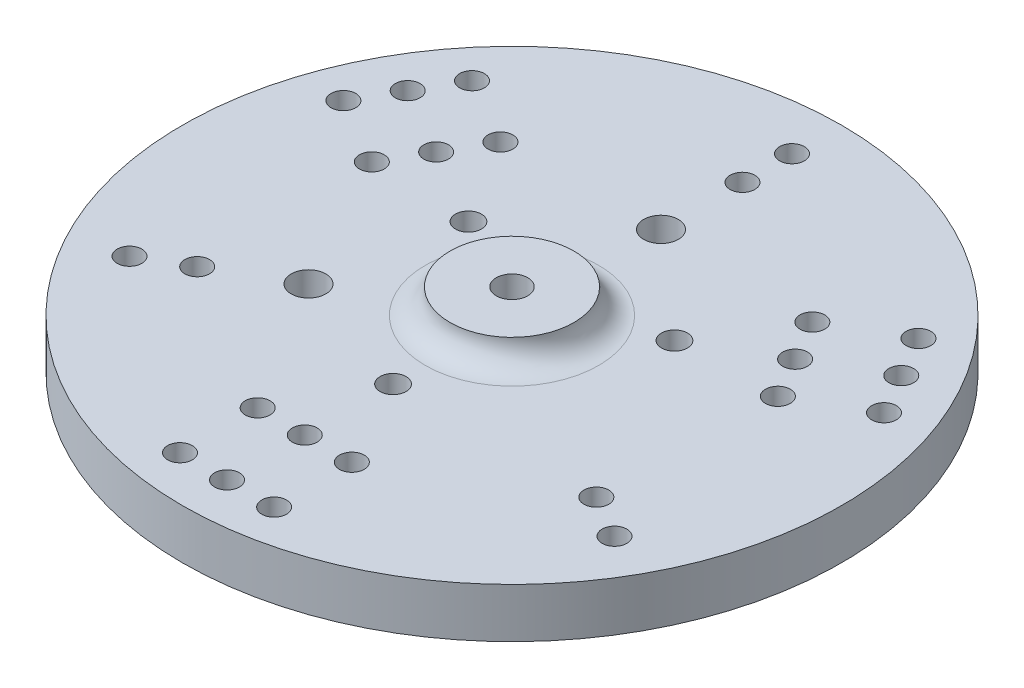
ISO-10303-21;
HEADER;
FILE_DESCRIPTION(('STEP AP214'),'2;1');
FILE_NAME('part.step','',(''),(''),'','','');
FILE_SCHEMA(('AUTOMOTIVE_DESIGN { 1 0 10303 214 1 1 1 1 }'));
ENDSEC;
DATA;
#1=APPLICATION_CONTEXT('core data for automotive mechanical design processes');
#2=APPLICATION_PROTOCOL_DEFINITION('international standard','automotive_design',2000,#1);
#3=PRODUCT_CONTEXT('',#1,'mechanical');
#4=PRODUCT('Part','Part','',(#3));
#5=PRODUCT_RELATED_PRODUCT_CATEGORY('part','',(#4));
#6=PRODUCT_DEFINITION_FORMATION('','',#4);
#7=PRODUCT_DEFINITION_CONTEXT('part definition',#1,'design');
#8=PRODUCT_DEFINITION('design','',#6,#7);
#9=PRODUCT_DEFINITION_SHAPE('','',#8);
#10=(LENGTH_UNIT() NAMED_UNIT(*) SI_UNIT(.MILLI.,.METRE.));
#11=(NAMED_UNIT(*) PLANE_ANGLE_UNIT() SI_UNIT($,.RADIAN.));
#12=(NAMED_UNIT(*) SI_UNIT($,.STERADIAN.) SOLID_ANGLE_UNIT());
#13=UNCERTAINTY_MEASURE_WITH_UNIT(LENGTH_MEASURE(1.E-05),#10,'distance_accuracy_value','');
#14=(GEOMETRIC_REPRESENTATION_CONTEXT(3) GLOBAL_UNCERTAINTY_ASSIGNED_CONTEXT((#13)) GLOBAL_UNIT_ASSIGNED_CONTEXT((#10,
#11,#12)) REPRESENTATION_CONTEXT('',''));
#15=CARTESIAN_POINT('',(0.,0.,0.));
#16=DIRECTION('',(0.,0.,1.));
#17=DIRECTION('',(1.,0.,0.));
#18=AXIS2_PLACEMENT_3D('',#15,#16,#17);
#19=CARTESIAN_POINT('',(0.,10.,0.));
#20=DIRECTION('',(0.,-1.,0.));
#21=DIRECTION('',(0.,0.,-1.));
#22=AXIS2_PLACEMENT_3D('',#19,#20,#21);
#23=CYLINDRICAL_SURFACE('',#22,4.125);
#24=CARTESIAN_POINT('',(0.,0.,0.));
#25=DIRECTION('',(0.,1.,0.));
#26=DIRECTION('',(0.,0.,1.));
#27=AXIS2_PLACEMENT_3D('',#24,#25,#26);
#28=CIRCLE('',#27,4.125);
#29=CARTESIAN_POINT('',(0.,0.,4.125));
#30=VERTEX_POINT('',#29);
#31=EDGE_CURVE('E330',#30,#30,#28,.T.);
#32=ORIENTED_EDGE('',*,*,#31,.F.);
#33=EDGE_LOOP('',(#32));
#34=FACE_BOUND('',#33,.T.);
#35=CARTESIAN_POINT('',(0.,9.5,0.));
#36=DIRECTION('',(0.,1.,0.));
#37=DIRECTION('',(0.,0.,1.));
#38=AXIS2_PLACEMENT_3D('',#35,#36,#37);
#39=CIRCLE('',#38,4.125);
#40=CARTESIAN_POINT('',(0.,9.5,4.125));
#41=VERTEX_POINT('',#40);
#42=EDGE_CURVE('E182',#41,#41,#39,.T.);
#43=ORIENTED_EDGE('',*,*,#42,.T.);
#44=EDGE_LOOP('',(#43));
#45=FACE_BOUND('',#44,.T.);
#46=ADVANCED_FACE('F163',(#34,#45),#23,.F.);
#47=CARTESIAN_POINT('',(0.,10.,0.));
#48=DIRECTION('',(0.,-1.,0.));
#49=DIRECTION('',(0.,0.,-1.));
#50=AXIS2_PLACEMENT_3D('',#47,#48,#49);
#51=CYLINDRICAL_SURFACE('',#50,66.5);
#52=CARTESIAN_POINT('',(0.,10.,0.));
#53=DIRECTION('',(0.,1.,0.));
#54=DIRECTION('',(0.,0.,1.));
#55=AXIS2_PLACEMENT_3D('',#52,#53,#54);
#56=CIRCLE('',#55,66.5);
#57=CARTESIAN_POINT('',(0.,10.,66.5));
#58=VERTEX_POINT('',#57);
#59=EDGE_CURVE('E172',#58,#58,#56,.T.);
#60=ORIENTED_EDGE('',*,*,#59,.F.);
#61=EDGE_LOOP('',(#60));
#62=FACE_BOUND('',#61,.T.);
#63=CARTESIAN_POINT('',(0.,0.,0.));
#64=DIRECTION('',(0.,1.,0.));
#65=DIRECTION('',(0.,0.,1.));
#66=AXIS2_PLACEMENT_3D('',#63,#64,#65);
#67=CIRCLE('',#66,66.5);
#68=CARTESIAN_POINT('',(0.,0.,66.5));
#69=VERTEX_POINT('',#68);
#70=EDGE_CURVE('E178',#69,#69,#67,.T.);
#71=ORIENTED_EDGE('',*,*,#70,.T.);
#72=EDGE_LOOP('',(#71));
#73=FACE_BOUND('',#72,.T.);
#74=ADVANCED_FACE('F429',(#62,#73),#51,.T.);
#75=CARTESIAN_POINT('',(0.,10.,0.));
#76=DIRECTION('',(0.,1.,0.));
#77=DIRECTION('',(0.,0.,1.));
#78=AXIS2_PLACEMENT_3D('',#75,#76,#77);
#79=PLANE('',#78);
#80=CARTESIAN_POINT('',(-20.7846096908265,10.,-12.));
#81=DIRECTION('',(0.,1.,0.));
#82=DIRECTION('',(0.,0.,1.));
#83=AXIS2_PLACEMENT_3D('',#80,#81,#82);
#84=CIRCLE('',#83,2.625);
#85=CARTESIAN_POINT('',(-20.7846096908265,10.,-9.37499999999998));
#86=VERTEX_POINT('',#85);
#87=EDGE_CURVE('E188',#86,#86,#84,.T.);
#88=ORIENTED_EDGE('',*,*,#87,.F.);
#89=EDGE_LOOP('',(#88));
#90=FACE_BOUND('',#89,.T.);
#91=CARTESIAN_POINT('',(20.7846096908265,10.,-12.));
#92=DIRECTION('',(0.,1.,0.));
#93=DIRECTION('',(0.,0.,1.));
#94=AXIS2_PLACEMENT_3D('',#91,#92,#93);
#95=CIRCLE('',#94,2.625);
#96=CARTESIAN_POINT('',(20.7846096908265,10.,-9.37500000000003));
#97=VERTEX_POINT('',#96);
#98=EDGE_CURVE('E870',#97,#97,#95,.T.);
#99=ORIENTED_EDGE('',*,*,#98,.F.);
#100=EDGE_LOOP('',(#99));
#101=FACE_BOUND('',#100,.T.);
#102=CARTESIAN_POINT('',(0.,10.,24.));
#103=DIRECTION('',(0.,1.,0.));
#104=DIRECTION('',(0.,0.,1.));
#105=AXIS2_PLACEMENT_3D('',#102,#103,#104);
#106=CIRCLE('',#105,2.625);
#107=CARTESIAN_POINT('',(0.,10.,26.625));
#108=VERTEX_POINT('',#107);
#109=EDGE_CURVE('E874',#108,#108,#106,.T.);
#110=ORIENTED_EDGE('',*,*,#109,.F.);
#111=EDGE_LOOP('',(#110));
#112=FACE_BOUND('',#111,.T.);
#113=CARTESIAN_POINT('',(0.,10.,-56.5));
#114=DIRECTION('',(0.,1.,0.));
#115=DIRECTION('',(0.,0.,1.));
#116=AXIS2_PLACEMENT_3D('',#113,#114,#115);
#117=CIRCLE('',#116,2.5);
#118=CARTESIAN_POINT('',(0.,10.,-54.));
#119=VERTEX_POINT('',#118);
#120=EDGE_CURVE('E232',#119,#119,#117,.T.);
#121=ORIENTED_EDGE('',*,*,#120,.F.);
#122=EDGE_LOOP('',(#121));
#123=FACE_BOUND('',#122,.T.);
#124=CARTESIAN_POINT('',(4.21537804662364E-13,10.,-30.0628174154518));
#125=DIRECTION('',(0.,1.,0.));
#126=DIRECTION('',(0.,0.,1.));
#127=AXIS2_PLACEMENT_3D('',#124,#125,#126);
#128=CIRCLE('',#127,3.5);
#129=CARTESIAN_POINT('',(4.21537804662364E-13,10.,-26.5628174154518));
#130=VERTEX_POINT('',#129);
#131=EDGE_CURVE('E200',#130,#130,#128,.T.);
#132=ORIENTED_EDGE('',*,*,#131,.F.);
#133=EDGE_LOOP('',(#132));
#134=FACE_BOUND('',#133,.T.);
#135=CARTESIAN_POINT('',(-26.0351635911147,10.,15.0314087077257));
#136=DIRECTION('',(0.,1.,0.));
#137=DIRECTION('',(0.,0.,1.));
#138=AXIS2_PLACEMENT_3D('',#135,#136,#137);
#139=CIRCLE('',#138,3.5);
#140=CARTESIAN_POINT('',(-26.0351635911147,10.,18.5314087077257));
#141=VERTEX_POINT('',#140);
#142=EDGE_CURVE('E890',#141,#141,#139,.T.);
#143=ORIENTED_EDGE('',*,*,#142,.F.);
#144=EDGE_LOOP('',(#143));
#145=FACE_BOUND('',#144,.T.);
#146=CARTESIAN_POINT('',(-48.9304353138178,10.,28.2500000000017));
#147=DIRECTION('',(0.,1.,0.));
#148=DIRECTION('',(0.,0.,1.));
#149=AXIS2_PLACEMENT_3D('',#146,#147,#148);
#150=CIRCLE('',#149,2.50000000000385);
#151=CARTESIAN_POINT('',(-48.9304353138178,10.,30.7500000000056));
#152=VERTEX_POINT('',#151);
#153=EDGE_CURVE('E227',#152,#152,#150,.T.);
#154=ORIENTED_EDGE('',*,*,#153,.F.);
#155=EDGE_LOOP('',(#154));
#156=FACE_BOUND('',#155,.T.);
#157=CARTESIAN_POINT('',(0.,10.,-46.5));
#158=DIRECTION('',(0.,1.,0.));
#159=DIRECTION('',(0.,0.,1.));
#160=AXIS2_PLACEMENT_3D('',#157,#158,#159);
#161=CIRCLE('',#160,2.5);
#162=CARTESIAN_POINT('',(0.,10.,-44.));
#163=VERTEX_POINT('',#162);
#164=EDGE_CURVE('E228',#163,#163,#161,.T.);
#165=ORIENTED_EDGE('',*,*,#164,.F.);
#166=EDGE_LOOP('',(#165));
#167=FACE_BOUND('',#166,.T.);
#168=CARTESIAN_POINT('',(40.2701812759794,10.,23.2499999999983));
#169=DIRECTION('',(0.,1.,0.));
#170=DIRECTION('',(0.,0.,1.));
#171=AXIS2_PLACEMENT_3D('',#168,#169,#170);
#172=CIRCLE('',#171,2.50000000000255);
#173=CARTESIAN_POINT('',(40.2701812759794,10.,25.7500000000008));
#174=VERTEX_POINT('',#173);
#175=EDGE_CURVE('E237',#174,#174,#172,.T.);
#176=ORIENTED_EDGE('',*,*,#175,.F.);
#177=EDGE_LOOP('',(#176));
#178=FACE_BOUND('',#177,.T.);
#179=CARTESIAN_POINT('',(48.9304353138238,10.,28.2499999999983));
#180=DIRECTION('',(0.,1.,0.));
#181=DIRECTION('',(0.,0.,1.));
#182=AXIS2_PLACEMENT_3D('',#179,#180,#181);
#183=CIRCLE('',#182,2.50000000000259);
#184=CARTESIAN_POINT('',(48.9304353138238,10.,30.7500000000009));
#185=VERTEX_POINT('',#184);
#186=EDGE_CURVE('E210',#185,#185,#183,.T.);
#187=ORIENTED_EDGE('',*,*,#186,.F.);
#188=EDGE_LOOP('',(#187));
#189=FACE_BOUND('',#188,.T.);
#190=CARTESIAN_POINT('',(-40.2701812759734,10.,23.2500000000017));
#191=DIRECTION('',(0.,1.,0.));
#192=DIRECTION('',(0.,0.,1.));
#193=AXIS2_PLACEMENT_3D('',#190,#191,#192);
#194=CIRCLE('',#193,2.50000000000376);
#195=CARTESIAN_POINT('',(-40.2701812759734,10.,25.7500000000055));
#196=VERTEX_POINT('',#195);
#197=EDGE_CURVE('E219',#196,#196,#194,.T.);
#198=ORIENTED_EDGE('',*,*,#197,.F.);
#199=EDGE_LOOP('',(#198));
#200=FACE_BOUND('',#199,.T.);
#201=CARTESIAN_POINT('',(0.,10.,0.));
#202=DIRECTION('',(0.,1.,0.));
#203=DIRECTION('',(0.,0.,1.));
#204=AXIS2_PLACEMENT_3D('',#201,#202,#203);
#205=CIRCLE('',#204,17.5);
#206=CARTESIAN_POINT('',(0.,10.,17.5));
#207=VERTEX_POINT('',#206);
#208=EDGE_CURVE('E11',#207,#207,#205,.F.);
#209=ORIENTED_EDGE('',*,*,#208,.T.);
#210=EDGE_LOOP('',(#209));
#211=FACE_BOUND('',#210,.T.);
#212=CARTESIAN_POINT('',(-31.4671823862652,10.,-29.1372413359521));
#213=DIRECTION('',(0.,1.,0.));
#214=DIRECTION('',(0.,0.,1.));
#215=AXIS2_PLACEMENT_3D('',#212,#213,#214);
#216=CIRCLE('',#215,2.5);
#217=CARTESIAN_POINT('',(-31.4671823862652,10.,-26.6372413359521));
#218=VERTEX_POINT('',#217);
#219=EDGE_CURVE('E278',#218,#218,#216,.T.);
#220=ORIENTED_EDGE('',*,*,#219,.F.);
#221=EDGE_LOOP('',(#220));
#222=FACE_BOUND('',#221,.T.);
#223=CARTESIAN_POINT('',(-9.49999999999998,10.,41.82));
#224=DIRECTION('',(0.,1.,0.));
#225=DIRECTION('',(0.,0.,1.));
#226=AXIS2_PLACEMENT_3D('',#223,#224,#225);
#227=CIRCLE('',#226,2.5);
#228=CARTESIAN_POINT('',(-9.49999999999998,10.,44.32));
#229=VERTEX_POINT('',#228);
#230=EDGE_CURVE('E283',#229,#229,#227,.T.);
#231=ORIENTED_EDGE('',*,*,#230,.F.);
#232=EDGE_LOOP('',(#231));
#233=FACE_BOUND('',#232,.T.);
#234=CARTESIAN_POINT('',(-9.49999999999995,10.,57.5));
#235=DIRECTION('',(0.,1.,0.));
#236=DIRECTION('',(0.,0.,1.));
#237=AXIS2_PLACEMENT_3D('',#234,#235,#236);
#238=CIRCLE('',#237,2.5);
#239=CARTESIAN_POINT('',(-9.49999999999995,10.,60.));
#240=VERTEX_POINT('',#239);
#241=EDGE_CURVE('E287',#240,#240,#238,.T.);
#242=ORIENTED_EDGE('',*,*,#241,.F.);
#243=EDGE_LOOP('',(#242));
#244=FACE_BOUND('',#243,.T.);
#245=CARTESIAN_POINT('',(9.50000000000004,10.,57.5));
#246=DIRECTION('',(0.,1.,0.));
#247=DIRECTION('',(0.,0.,1.));
#248=AXIS2_PLACEMENT_3D('',#245,#246,#247);
#249=CIRCLE('',#248,2.50000000000001);
#250=CARTESIAN_POINT('',(9.50000000000004,10.,60.));
#251=VERTEX_POINT('',#250);
#252=EDGE_CURVE('E266',#251,#251,#249,.T.);
#253=ORIENTED_EDGE('',*,*,#252,.F.);
#254=EDGE_LOOP('',(#253));
#255=FACE_BOUND('',#254,.T.);
#256=CARTESIAN_POINT('',(9.50000000000003,10.,41.82));
#257=DIRECTION('',(0.,1.,0.));
#258=DIRECTION('',(0.,0.,1.));
#259=AXIS2_PLACEMENT_3D('',#256,#257,#258);
#260=CIRCLE('',#259,2.5);
#261=CARTESIAN_POINT('',(9.50000000000003,10.,44.32));
#262=VERTEX_POINT('',#261);
#263=EDGE_CURVE('E262',#262,#262,#260,.T.);
#264=ORIENTED_EDGE('',*,*,#263,.F.);
#265=EDGE_LOOP('',(#264));
#266=FACE_BOUND('',#265,.T.);
#267=CARTESIAN_POINT('',(31.4671823862652,10.,-29.1372413359522));
#268=DIRECTION('',(0.,1.,0.));
#269=DIRECTION('',(0.,0.,1.));
#270=AXIS2_PLACEMENT_3D('',#267,#268,#269);
#271=CIRCLE('',#270,2.5);
#272=CARTESIAN_POINT('',(31.4671823862652,10.,-26.6372413359522));
#273=VERTEX_POINT('',#272);
#274=EDGE_CURVE('E267',#273,#273,#271,.T.);
#275=ORIENTED_EDGE('',*,*,#274,.F.);
#276=EDGE_LOOP('',(#275));
#277=FACE_BOUND('',#276,.T.);
#278=CARTESIAN_POINT('',(40.9671823862652,10.,-12.6827586640478));
#279=DIRECTION('',(0.,1.,0.));
#280=DIRECTION('',(0.,0.,1.));
#281=AXIS2_PLACEMENT_3D('',#278,#279,#280);
#282=CIRCLE('',#281,2.49999999999999);
#283=CARTESIAN_POINT('',(40.9671823862652,10.,-10.1827586640478));
#284=VERTEX_POINT('',#283);
#285=EDGE_CURVE('E271',#284,#284,#282,.T.);
#286=ORIENTED_EDGE('',*,*,#285,.F.);
#287=EDGE_LOOP('',(#286));
#288=FACE_BOUND('',#287,.T.);
#289=CARTESIAN_POINT('',(54.5464607176052,10.,-20.5227586640478));
#290=DIRECTION('',(0.,1.,0.));
#291=DIRECTION('',(0.,0.,1.));
#292=AXIS2_PLACEMENT_3D('',#289,#290,#291);
#293=CIRCLE('',#292,2.5);
#294=CARTESIAN_POINT('',(54.5464607176052,10.,-18.0227586640478));
#295=VERTEX_POINT('',#294);
#296=EDGE_CURVE('E261',#295,#295,#293,.T.);
#297=ORIENTED_EDGE('',*,*,#296,.F.);
#298=EDGE_LOOP('',(#297));
#299=FACE_BOUND('',#298,.T.);
#300=CARTESIAN_POINT('',(-36.2171823862653,10.,-20.91));
#301=DIRECTION('',(0.,1.,0.));
#302=DIRECTION('',(0.,0.,1.));
#303=AXIS2_PLACEMENT_3D('',#300,#301,#302);
#304=CIRCLE('',#303,2.49999999999999);
#305=CARTESIAN_POINT('',(-36.2171823862653,10.,-18.41));
#306=VERTEX_POINT('',#305);
#307=EDGE_CURVE('E306',#306,#306,#304,.T.);
#308=ORIENTED_EDGE('',*,*,#307,.F.);
#309=EDGE_LOOP('',(#308));
#310=FACE_BOUND('',#309,.T.);
#311=CARTESIAN_POINT('',(49.7964607176052,10.,-28.7500000000001));
#312=DIRECTION('',(0.,1.,0.));
#313=DIRECTION('',(0.,0.,1.));
#314=AXIS2_PLACEMENT_3D('',#311,#312,#313);
#315=CIRCLE('',#314,2.5);
#316=CARTESIAN_POINT('',(49.7964607176052,10.,-26.2500000000001));
#317=VERTEX_POINT('',#316);
#318=EDGE_CURVE('E310',#317,#317,#315,.T.);
#319=ORIENTED_EDGE('',*,*,#318,.F.);
#320=EDGE_LOOP('',(#319));
#321=FACE_BOUND('',#320,.T.);
#322=CARTESIAN_POINT('',(36.2171823862652,10.,-20.91));
#323=DIRECTION('',(0.,1.,0.));
#324=DIRECTION('',(0.,0.,1.));
#325=AXIS2_PLACEMENT_3D('',#322,#323,#324);
#326=CIRCLE('',#325,2.49999999999999);
#327=CARTESIAN_POINT('',(36.2171823862652,10.,-18.4100000000001));
#328=VERTEX_POINT('',#327);
#329=EDGE_CURVE('E314',#328,#328,#326,.T.);
#330=ORIENTED_EDGE('',*,*,#329,.F.);
#331=EDGE_LOOP('',(#330));
#332=FACE_BOUND('',#331,.T.);
#333=CARTESIAN_POINT('',(0.,10.,41.82));
#334=DIRECTION('',(0.,1.,0.));
#335=DIRECTION('',(0.,0.,1.));
#336=AXIS2_PLACEMENT_3D('',#333,#334,#335);
#337=CIRCLE('',#336,2.5);
#338=CARTESIAN_POINT('',(0.,10.,44.32));
#339=VERTEX_POINT('',#338);
#340=EDGE_CURVE('E318',#339,#339,#337,.T.);
#341=ORIENTED_EDGE('',*,*,#340,.F.);
#342=EDGE_LOOP('',(#341));
#343=FACE_BOUND('',#342,.T.);
#344=CARTESIAN_POINT('',(-45.0464607176052,10.,-36.9772413359521));
#345=DIRECTION('',(0.,1.,0.));
#346=DIRECTION('',(0.,0.,1.));
#347=AXIS2_PLACEMENT_3D('',#344,#345,#346);
#348=CIRCLE('',#347,2.5);
#349=CARTESIAN_POINT('',(-45.0464607176052,10.,-34.4772413359521));
#350=VERTEX_POINT('',#349);
#351=EDGE_CURVE('E282',#350,#350,#348,.T.);
#352=ORIENTED_EDGE('',*,*,#351,.F.);
#353=EDGE_LOOP('',(#352));
#354=FACE_BOUND('',#353,.T.);
#355=CARTESIAN_POINT('',(-54.5464607176053,10.,-20.5227586640478));
#356=DIRECTION('',(0.,1.,0.));
#357=DIRECTION('',(0.,0.,1.));
#358=AXIS2_PLACEMENT_3D('',#355,#356,#357);
#359=CIRCLE('',#358,2.5);
#360=CARTESIAN_POINT('',(-54.5464607176053,10.,-18.0227586640478));
#361=VERTEX_POINT('',#360);
#362=EDGE_CURVE('E294',#361,#361,#359,.T.);
#363=ORIENTED_EDGE('',*,*,#362,.F.);
#364=EDGE_LOOP('',(#363));
#365=FACE_BOUND('',#364,.T.);
#366=CARTESIAN_POINT('',(-40.9671823862653,10.,-12.6827586640478));
#367=DIRECTION('',(0.,1.,0.));
#368=DIRECTION('',(0.,0.,1.));
#369=AXIS2_PLACEMENT_3D('',#366,#367,#368);
#370=CIRCLE('',#369,2.5);
#371=CARTESIAN_POINT('',(-40.9671823862653,10.,-10.1827586640478));
#372=VERTEX_POINT('',#371);
#373=EDGE_CURVE('E298',#372,#372,#370,.T.);
#374=ORIENTED_EDGE('',*,*,#373,.F.);
#375=EDGE_LOOP('',(#374));
#376=FACE_BOUND('',#375,.T.);
#377=CARTESIAN_POINT('',(-49.7964607176053,10.,-28.7499999999999));
#378=DIRECTION('',(0.,1.,0.));
#379=DIRECTION('',(0.,0.,1.));
#380=AXIS2_PLACEMENT_3D('',#377,#378,#379);
#381=CIRCLE('',#380,2.5);
#382=CARTESIAN_POINT('',(-49.7964607176053,10.,-26.2499999999999));
#383=VERTEX_POINT('',#382);
#384=EDGE_CURVE('E302',#383,#383,#381,.T.);
#385=ORIENTED_EDGE('',*,*,#384,.F.);
#386=EDGE_LOOP('',(#385));
#387=FACE_BOUND('',#386,.T.);
#388=CARTESIAN_POINT('',(45.0464607176052,10.,-36.9772413359522));
#389=DIRECTION('',(0.,1.,0.));
#390=DIRECTION('',(0.,0.,1.));
#391=AXIS2_PLACEMENT_3D('',#388,#389,#390);
#392=CIRCLE('',#391,2.5);
#393=CARTESIAN_POINT('',(45.0464607176052,10.,-34.4772413359522));
#394=VERTEX_POINT('',#393);
#395=EDGE_CURVE('E257',#394,#394,#392,.T.);
#396=ORIENTED_EDGE('',*,*,#395,.F.);
#397=EDGE_LOOP('',(#396));
#398=FACE_BOUND('',#397,.T.);
#399=CARTESIAN_POINT('',(0.,10.,57.5));
#400=DIRECTION('',(0.,1.,0.));
#401=DIRECTION('',(0.,0.,1.));
#402=AXIS2_PLACEMENT_3D('',#399,#400,#401);
#403=CIRCLE('',#402,2.5);
#404=CARTESIAN_POINT('',(0.,10.,60.));
#405=VERTEX_POINT('',#404);
#406=EDGE_CURVE('E322',#405,#405,#403,.T.);
#407=ORIENTED_EDGE('',*,*,#406,.F.);
#408=EDGE_LOOP('',(#407));
#409=FACE_BOUND('',#408,.T.);
#410=ORIENTED_EDGE('',*,*,#59,.T.);
#411=EDGE_LOOP('',(#410));
#412=FACE_BOUND('',#411,.T.);
#413=ADVANCED_FACE('F435',(#90,#101,#112,#123,#134,#145,#156,#167,#178,#189,#200,#211,#222,#233,
#244,#255,#266,#277,#288,#299,#310,#321,#332,#343,#354,#365,#376,#387,#398,#409,#412),#79,.T.);
#414=CARTESIAN_POINT('',(0.,0.,0.));
#415=DIRECTION('',(0.,1.,0.));
#416=DIRECTION('',(0.,0.,1.));
#417=AXIS2_PLACEMENT_3D('',#414,#415,#416);
#418=PLANE('',#417);
#419=CARTESIAN_POINT('',(-20.7846096908265,0.,-12.));
#420=DIRECTION('',(0.,1.,0.));
#421=DIRECTION('',(0.,0.,1.));
#422=AXIS2_PLACEMENT_3D('',#419,#420,#421);
#423=CIRCLE('',#422,2.625);
#424=CARTESIAN_POINT('',(-20.7846096908265,0.,-9.37499999999998));
#425=VERTEX_POINT('',#424);
#426=EDGE_CURVE('E167',#425,#425,#423,.T.);
#427=ORIENTED_EDGE('',*,*,#426,.T.);
#428=EDGE_LOOP('',(#427));
#429=FACE_BOUND('',#428,.T.);
#430=CARTESIAN_POINT('',(20.7846096908265,0.,-12.));
#431=DIRECTION('',(0.,1.,0.));
#432=DIRECTION('',(0.,0.,1.));
#433=AXIS2_PLACEMENT_3D('',#430,#431,#432);
#434=CIRCLE('',#433,2.625);
#435=CARTESIAN_POINT('',(20.7846096908265,0.,-9.37500000000003));
#436=VERTEX_POINT('',#435);
#437=EDGE_CURVE('E187',#436,#436,#434,.T.);
#438=ORIENTED_EDGE('',*,*,#437,.T.);
#439=EDGE_LOOP('',(#438));
#440=FACE_BOUND('',#439,.T.);
#441=CARTESIAN_POINT('',(0.,0.,24.));
#442=DIRECTION('',(0.,1.,0.));
#443=DIRECTION('',(0.,0.,1.));
#444=AXIS2_PLACEMENT_3D('',#441,#442,#443);
#445=CIRCLE('',#444,2.625);
#446=CARTESIAN_POINT('',(0.,0.,26.625));
#447=VERTEX_POINT('',#446);
#448=EDGE_CURVE('E184',#447,#447,#445,.T.);
#449=ORIENTED_EDGE('',*,*,#448,.T.);
#450=EDGE_LOOP('',(#449));
#451=FACE_BOUND('',#450,.T.);
#452=CARTESIAN_POINT('',(0.,0.,-56.5));
#453=DIRECTION('',(0.,1.,0.));
#454=DIRECTION('',(0.,0.,1.));
#455=AXIS2_PLACEMENT_3D('',#452,#453,#454);
#456=CIRCLE('',#455,2.5);
#457=CARTESIAN_POINT('',(0.,0.,-54.));
#458=VERTEX_POINT('',#457);
#459=EDGE_CURVE('E253',#458,#458,#456,.T.);
#460=ORIENTED_EDGE('',*,*,#459,.T.);
#461=EDGE_LOOP('',(#460));
#462=FACE_BOUND('',#461,.T.);
#463=CARTESIAN_POINT('',(4.21537804662364E-13,0.,-30.0628174154518));
#464=DIRECTION('',(0.,1.,0.));
#465=DIRECTION('',(0.,0.,1.));
#466=AXIS2_PLACEMENT_3D('',#463,#464,#465);
#467=CIRCLE('',#466,3.5);
#468=CARTESIAN_POINT('',(4.21537804662364E-13,0.,-26.5628174154518));
#469=VERTEX_POINT('',#468);
#470=EDGE_CURVE('E195',#469,#469,#467,.T.);
#471=ORIENTED_EDGE('',*,*,#470,.T.);
#472=EDGE_LOOP('',(#471));
#473=FACE_BOUND('',#472,.T.);
#474=CARTESIAN_POINT('',(-26.0351635911147,0.,15.0314087077257));
#475=DIRECTION('',(0.,1.,0.));
#476=DIRECTION('',(0.,0.,1.));
#477=AXIS2_PLACEMENT_3D('',#474,#475,#476);
#478=CIRCLE('',#477,3.5);
#479=CARTESIAN_POINT('',(-26.0351635911147,0.,18.5314087077257));
#480=VERTEX_POINT('',#479);
#481=EDGE_CURVE('E206',#480,#480,#478,.T.);
#482=ORIENTED_EDGE('',*,*,#481,.T.);
#483=EDGE_LOOP('',(#482));
#484=FACE_BOUND('',#483,.T.);
#485=CARTESIAN_POINT('',(-48.9304353138178,0.,28.2500000000017));
#486=DIRECTION('',(0.,1.,0.));
#487=DIRECTION('',(0.,0.,1.));
#488=AXIS2_PLACEMENT_3D('',#485,#486,#487);
#489=CIRCLE('',#488,2.50000000000385);
#490=CARTESIAN_POINT('',(-48.9304353138178,0.,30.7500000000056));
#491=VERTEX_POINT('',#490);
#492=EDGE_CURVE('E464',#491,#491,#489,.T.);
#493=ORIENTED_EDGE('',*,*,#492,.T.);
#494=EDGE_LOOP('',(#493));
#495=FACE_BOUND('',#494,.T.);
#496=CARTESIAN_POINT('',(0.,0.,-46.5));
#497=DIRECTION('',(0.,1.,0.));
#498=DIRECTION('',(0.,0.,1.));
#499=AXIS2_PLACEMENT_3D('',#496,#497,#498);
#500=CIRCLE('',#499,2.5);
#501=CARTESIAN_POINT('',(0.,0.,-44.));
#502=VERTEX_POINT('',#501);
#503=EDGE_CURVE('E233',#502,#502,#500,.T.);
#504=ORIENTED_EDGE('',*,*,#503,.T.);
#505=EDGE_LOOP('',(#504));
#506=FACE_BOUND('',#505,.T.);
#507=CARTESIAN_POINT('',(40.2701812759794,0.,23.2499999999983));
#508=DIRECTION('',(0.,1.,0.));
#509=DIRECTION('',(0.,0.,1.));
#510=AXIS2_PLACEMENT_3D('',#507,#508,#509);
#511=CIRCLE('',#510,2.50000000000255);
#512=CARTESIAN_POINT('',(40.2701812759794,0.,25.7500000000008));
#513=VERTEX_POINT('',#512);
#514=EDGE_CURVE('E214',#513,#513,#511,.T.);
#515=ORIENTED_EDGE('',*,*,#514,.T.);
#516=EDGE_LOOP('',(#515));
#517=FACE_BOUND('',#516,.T.);
#518=CARTESIAN_POINT('',(48.9304353138238,0.,28.2499999999983));
#519=DIRECTION('',(0.,1.,0.));
#520=DIRECTION('',(0.,0.,1.));
#521=AXIS2_PLACEMENT_3D('',#518,#519,#520);
#522=CIRCLE('',#521,2.50000000000259);
#523=CARTESIAN_POINT('',(48.9304353138238,0.,30.7500000000009));
#524=VERTEX_POINT('',#523);
#525=EDGE_CURVE('E215',#524,#524,#522,.T.);
#526=ORIENTED_EDGE('',*,*,#525,.T.);
#527=EDGE_LOOP('',(#526));
#528=FACE_BOUND('',#527,.T.);
#529=CARTESIAN_POINT('',(-40.2701812759734,0.,23.2500000000017));
#530=DIRECTION('',(0.,1.,0.));
#531=DIRECTION('',(0.,0.,1.));
#532=AXIS2_PLACEMENT_3D('',#529,#530,#531);
#533=CIRCLE('',#532,2.50000000000376);
#534=CARTESIAN_POINT('',(-40.2701812759734,0.,25.7500000000055));
#535=VERTEX_POINT('',#534);
#536=EDGE_CURVE('E223',#535,#535,#533,.T.);
#537=ORIENTED_EDGE('',*,*,#536,.T.);
#538=EDGE_LOOP('',(#537));
#539=FACE_BOUND('',#538,.T.);
#540=CARTESIAN_POINT('',(-31.4671823862652,0.,-29.1372413359521));
#541=DIRECTION('',(0.,1.,0.));
#542=DIRECTION('',(0.,0.,1.));
#543=AXIS2_PLACEMENT_3D('',#540,#541,#542);
#544=CIRCLE('',#543,2.5);
#545=CARTESIAN_POINT('',(-31.4671823862652,0.,-26.6372413359521));
#546=VERTEX_POINT('',#545);
#547=EDGE_CURVE('E333',#546,#546,#544,.T.);
#548=ORIENTED_EDGE('',*,*,#547,.T.);
#549=EDGE_LOOP('',(#548));
#550=FACE_BOUND('',#549,.T.);
#551=CARTESIAN_POINT('',(-9.49999999999998,0.,41.82));
#552=DIRECTION('',(0.,1.,0.));
#553=DIRECTION('',(0.,0.,1.));
#554=AXIS2_PLACEMENT_3D('',#551,#552,#553);
#555=CIRCLE('',#554,2.5);
#556=CARTESIAN_POINT('',(-9.49999999999998,0.,44.32));
#557=VERTEX_POINT('',#556);
#558=EDGE_CURVE('E401',#557,#557,#555,.T.);
#559=ORIENTED_EDGE('',*,*,#558,.T.);
#560=EDGE_LOOP('',(#559));
#561=FACE_BOUND('',#560,.T.);
#562=CARTESIAN_POINT('',(-9.49999999999995,0.,57.5));
#563=DIRECTION('',(0.,1.,0.));
#564=DIRECTION('',(0.,0.,1.));
#565=AXIS2_PLACEMENT_3D('',#562,#563,#564);
#566=CIRCLE('',#565,2.5);
#567=CARTESIAN_POINT('',(-9.49999999999995,0.,60.));
#568=VERTEX_POINT('',#567);
#569=EDGE_CURVE('E397',#568,#568,#566,.T.);
#570=ORIENTED_EDGE('',*,*,#569,.T.);
#571=EDGE_LOOP('',(#570));
#572=FACE_BOUND('',#571,.T.);
#573=CARTESIAN_POINT('',(9.50000000000004,0.,57.5));
#574=DIRECTION('',(0.,1.,0.));
#575=DIRECTION('',(0.,0.,1.));
#576=AXIS2_PLACEMENT_3D('',#573,#574,#575);
#577=CIRCLE('',#576,2.50000000000001);
#578=CARTESIAN_POINT('',(9.50000000000004,0.,60.));
#579=VERTEX_POINT('',#578);
#580=EDGE_CURVE('E393',#579,#579,#577,.T.);
#581=ORIENTED_EDGE('',*,*,#580,.T.);
#582=EDGE_LOOP('',(#581));
#583=FACE_BOUND('',#582,.T.);
#584=CARTESIAN_POINT('',(9.50000000000003,0.,41.82));
#585=DIRECTION('',(0.,1.,0.));
#586=DIRECTION('',(0.,0.,1.));
#587=AXIS2_PLACEMENT_3D('',#584,#585,#586);
#588=CIRCLE('',#587,2.5);
#589=CARTESIAN_POINT('',(9.50000000000003,0.,44.32));
#590=VERTEX_POINT('',#589);
#591=EDGE_CURVE('E389',#590,#590,#588,.T.);
#592=ORIENTED_EDGE('',*,*,#591,.T.);
#593=EDGE_LOOP('',(#592));
#594=FACE_BOUND('',#593,.T.);
#595=CARTESIAN_POINT('',(31.4671823862652,0.,-29.1372413359522));
#596=DIRECTION('',(0.,1.,0.));
#597=DIRECTION('',(0.,0.,1.));
#598=AXIS2_PLACEMENT_3D('',#595,#596,#597);
#599=CIRCLE('',#598,2.5);
#600=CARTESIAN_POINT('',(31.4671823862652,0.,-26.6372413359522));
#601=VERTEX_POINT('',#600);
#602=EDGE_CURVE('E385',#601,#601,#599,.T.);
#603=ORIENTED_EDGE('',*,*,#602,.T.);
#604=EDGE_LOOP('',(#603));
#605=FACE_BOUND('',#604,.T.);
#606=CARTESIAN_POINT('',(40.9671823862652,0.,-12.6827586640478));
#607=DIRECTION('',(0.,1.,0.));
#608=DIRECTION('',(0.,0.,1.));
#609=AXIS2_PLACEMENT_3D('',#606,#607,#608);
#610=CIRCLE('',#609,2.49999999999999);
#611=CARTESIAN_POINT('',(40.9671823862652,0.,-10.1827586640478));
#612=VERTEX_POINT('',#611);
#613=EDGE_CURVE('E381',#612,#612,#610,.T.);
#614=ORIENTED_EDGE('',*,*,#613,.T.);
#615=EDGE_LOOP('',(#614));
#616=FACE_BOUND('',#615,.T.);
#617=CARTESIAN_POINT('',(54.5464607176052,0.,-20.5227586640478));
#618=DIRECTION('',(0.,1.,0.));
#619=DIRECTION('',(0.,0.,1.));
#620=AXIS2_PLACEMENT_3D('',#617,#618,#619);
#621=CIRCLE('',#620,2.5);
#622=CARTESIAN_POINT('',(54.5464607176052,0.,-18.0227586640478));
#623=VERTEX_POINT('',#622);
#624=EDGE_CURVE('E377',#623,#623,#621,.T.);
#625=ORIENTED_EDGE('',*,*,#624,.T.);
#626=EDGE_LOOP('',(#625));
#627=FACE_BOUND('',#626,.T.);
#628=CARTESIAN_POINT('',(-36.2171823862653,0.,-20.91));
#629=DIRECTION('',(0.,1.,0.));
#630=DIRECTION('',(0.,0.,1.));
#631=AXIS2_PLACEMENT_3D('',#628,#629,#630);
#632=CIRCLE('',#631,2.49999999999999);
#633=CARTESIAN_POINT('',(-36.2171823862653,0.,-18.41));
#634=VERTEX_POINT('',#633);
#635=EDGE_CURVE('E373',#634,#634,#632,.T.);
#636=ORIENTED_EDGE('',*,*,#635,.T.);
#637=EDGE_LOOP('',(#636));
#638=FACE_BOUND('',#637,.T.);
#639=CARTESIAN_POINT('',(49.7964607176052,0.,-28.7500000000001));
#640=DIRECTION('',(0.,1.,0.));
#641=DIRECTION('',(0.,0.,1.));
#642=AXIS2_PLACEMENT_3D('',#639,#640,#641);
#643=CIRCLE('',#642,2.5);
#644=CARTESIAN_POINT('',(49.7964607176052,0.,-26.2500000000001));
#645=VERTEX_POINT('',#644);
#646=EDGE_CURVE('E369',#645,#645,#643,.T.);
#647=ORIENTED_EDGE('',*,*,#646,.T.);
#648=EDGE_LOOP('',(#647));
#649=FACE_BOUND('',#648,.T.);
#650=CARTESIAN_POINT('',(36.2171823862652,0.,-20.91));
#651=DIRECTION('',(0.,1.,0.));
#652=DIRECTION('',(0.,0.,1.));
#653=AXIS2_PLACEMENT_3D('',#650,#651,#652);
#654=CIRCLE('',#653,2.49999999999999);
#655=CARTESIAN_POINT('',(36.2171823862652,0.,-18.4100000000001));
#656=VERTEX_POINT('',#655);
#657=EDGE_CURVE('E365',#656,#656,#654,.T.);
#658=ORIENTED_EDGE('',*,*,#657,.T.);
#659=EDGE_LOOP('',(#658));
#660=FACE_BOUND('',#659,.T.);
#661=CARTESIAN_POINT('',(0.,0.,41.82));
#662=DIRECTION('',(0.,1.,0.));
#663=DIRECTION('',(0.,0.,1.));
#664=AXIS2_PLACEMENT_3D('',#661,#662,#663);
#665=CIRCLE('',#664,2.5);
#666=CARTESIAN_POINT('',(0.,0.,44.32));
#667=VERTEX_POINT('',#666);
#668=EDGE_CURVE('E361',#667,#667,#665,.T.);
#669=ORIENTED_EDGE('',*,*,#668,.T.);
#670=EDGE_LOOP('',(#669));
#671=FACE_BOUND('',#670,.T.);
#672=CARTESIAN_POINT('',(-45.0464607176052,0.,-36.9772413359521));
#673=DIRECTION('',(0.,1.,0.));
#674=DIRECTION('',(0.,0.,1.));
#675=AXIS2_PLACEMENT_3D('',#672,#673,#674);
#676=CIRCLE('',#675,2.5);
#677=CARTESIAN_POINT('',(-45.0464607176052,0.,-34.4772413359521));
#678=VERTEX_POINT('',#677);
#679=EDGE_CURVE('E357',#678,#678,#676,.T.);
#680=ORIENTED_EDGE('',*,*,#679,.T.);
#681=EDGE_LOOP('',(#680));
#682=FACE_BOUND('',#681,.T.);
#683=CARTESIAN_POINT('',(-54.5464607176053,0.,-20.5227586640478));
#684=DIRECTION('',(0.,1.,0.));
#685=DIRECTION('',(0.,0.,1.));
#686=AXIS2_PLACEMENT_3D('',#683,#684,#685);
#687=CIRCLE('',#686,2.5);
#688=CARTESIAN_POINT('',(-54.5464607176053,0.,-18.0227586640478));
#689=VERTEX_POINT('',#688);
#690=EDGE_CURVE('E353',#689,#689,#687,.T.);
#691=ORIENTED_EDGE('',*,*,#690,.T.);
#692=EDGE_LOOP('',(#691));
#693=FACE_BOUND('',#692,.T.);
#694=CARTESIAN_POINT('',(-40.9671823862653,0.,-12.6827586640478));
#695=DIRECTION('',(0.,1.,0.));
#696=DIRECTION('',(0.,0.,1.));
#697=AXIS2_PLACEMENT_3D('',#694,#695,#696);
#698=CIRCLE('',#697,2.5);
#699=CARTESIAN_POINT('',(-40.9671823862653,0.,-10.1827586640478));
#700=VERTEX_POINT('',#699);
#701=EDGE_CURVE('E349',#700,#700,#698,.T.);
#702=ORIENTED_EDGE('',*,*,#701,.T.);
#703=EDGE_LOOP('',(#702));
#704=FACE_BOUND('',#703,.T.);
#705=CARTESIAN_POINT('',(-49.7964607176053,0.,-28.7499999999999));
#706=DIRECTION('',(0.,1.,0.));
#707=DIRECTION('',(0.,0.,1.));
#708=AXIS2_PLACEMENT_3D('',#705,#706,#707);
#709=CIRCLE('',#708,2.5);
#710=CARTESIAN_POINT('',(-49.7964607176053,0.,-26.2499999999999));
#711=VERTEX_POINT('',#710);
#712=EDGE_CURVE('E345',#711,#711,#709,.T.);
#713=ORIENTED_EDGE('',*,*,#712,.T.);
#714=EDGE_LOOP('',(#713));
#715=FACE_BOUND('',#714,.T.);
#716=CARTESIAN_POINT('',(45.0464607176052,0.,-36.9772413359522));
#717=DIRECTION('',(0.,1.,0.));
#718=DIRECTION('',(0.,0.,1.));
#719=AXIS2_PLACEMENT_3D('',#716,#717,#718);
#720=CIRCLE('',#719,2.5);
#721=CARTESIAN_POINT('',(45.0464607176052,0.,-34.4772413359522));
#722=VERTEX_POINT('',#721);
#723=EDGE_CURVE('E341',#722,#722,#720,.T.);
#724=ORIENTED_EDGE('',*,*,#723,.T.);
#725=EDGE_LOOP('',(#724));
#726=FACE_BOUND('',#725,.T.);
#727=CARTESIAN_POINT('',(0.,0.,57.5));
#728=DIRECTION('',(0.,1.,0.));
#729=DIRECTION('',(0.,0.,1.));
#730=AXIS2_PLACEMENT_3D('',#727,#728,#729);
#731=CIRCLE('',#730,2.5);
#732=CARTESIAN_POINT('',(0.,0.,60.));
#733=VERTEX_POINT('',#732);
#734=EDGE_CURVE('E329',#733,#733,#731,.T.);
#735=ORIENTED_EDGE('',*,*,#734,.T.);
#736=EDGE_LOOP('',(#735));
#737=FACE_BOUND('',#736,.T.);
#738=ORIENTED_EDGE('',*,*,#70,.F.);
#739=EDGE_LOOP('',(#738));
#740=FACE_BOUND('',#739,.T.);
#741=ORIENTED_EDGE('',*,*,#31,.T.);
#742=EDGE_LOOP('',(#741));
#743=FACE_BOUND('',#742,.T.);
#744=ADVANCED_FACE('F408',(#429,#440,#451,#462,#473,#484,#495,#506,#517,#528,#539,#550,#561,
#572,#583,#594,#605,#616,#627,#638,#649,#660,#671,#682,#693,#704,#715,#726,#737,#740,#743),#418,.F.);
#745=CARTESIAN_POINT('',(0.,-10.,57.5));
#746=DIRECTION('',(0.,1.,0.));
#747=DIRECTION('',(0.,0.,1.));
#748=AXIS2_PLACEMENT_3D('',#745,#746,#747);
#749=CYLINDRICAL_SURFACE('',#748,2.5);
#750=ORIENTED_EDGE('',*,*,#406,.T.);
#751=EDGE_LOOP('',(#750));
#752=FACE_BOUND('',#751,.T.);
#753=ORIENTED_EDGE('',*,*,#734,.F.);
#754=EDGE_LOOP('',(#753));
#755=FACE_BOUND('',#754,.T.);
#756=ADVANCED_FACE('F441',(#752,#755),#749,.F.);
#757=CARTESIAN_POINT('',(45.0464607176052,-10.,-36.9772413359522));
#758=DIRECTION('',(0.,1.,0.));
#759=DIRECTION('',(0.,0.,1.));
#760=AXIS2_PLACEMENT_3D('',#757,#758,#759);
#761=CYLINDRICAL_SURFACE('',#760,2.5);
#762=ORIENTED_EDGE('',*,*,#395,.T.);
#763=EDGE_LOOP('',(#762));
#764=FACE_BOUND('',#763,.T.);
#765=ORIENTED_EDGE('',*,*,#723,.F.);
#766=EDGE_LOOP('',(#765));
#767=FACE_BOUND('',#766,.T.);
#768=ADVANCED_FACE('F450',(#764,#767),#761,.F.);
#769=CARTESIAN_POINT('',(-49.7964607176053,-10.,-28.7499999999999));
#770=DIRECTION('',(0.,1.,0.));
#771=DIRECTION('',(0.,0.,1.));
#772=AXIS2_PLACEMENT_3D('',#769,#770,#771);
#773=CYLINDRICAL_SURFACE('',#772,2.5);
#774=ORIENTED_EDGE('',*,*,#384,.T.);
#775=EDGE_LOOP('',(#774));
#776=FACE_BOUND('',#775,.T.);
#777=ORIENTED_EDGE('',*,*,#712,.F.);
#778=EDGE_LOOP('',(#777));
#779=FACE_BOUND('',#778,.T.);
#780=ADVANCED_FACE('F528',(#776,#779),#773,.F.);
#781=CARTESIAN_POINT('',(-40.9671823862653,-10.,-12.6827586640478));
#782=DIRECTION('',(0.,1.,0.));
#783=DIRECTION('',(0.,0.,1.));
#784=AXIS2_PLACEMENT_3D('',#781,#782,#783);
#785=CYLINDRICAL_SURFACE('',#784,2.5);
#786=ORIENTED_EDGE('',*,*,#373,.T.);
#787=EDGE_LOOP('',(#786));
#788=FACE_BOUND('',#787,.T.);
#789=ORIENTED_EDGE('',*,*,#701,.F.);
#790=EDGE_LOOP('',(#789));
#791=FACE_BOUND('',#790,.T.);
#792=ADVANCED_FACE('F535',(#788,#791),#785,.F.);
#793=CARTESIAN_POINT('',(-54.5464607176053,-10.,-20.5227586640478));
#794=DIRECTION('',(0.,1.,0.));
#795=DIRECTION('',(0.,0.,1.));
#796=AXIS2_PLACEMENT_3D('',#793,#794,#795);
#797=CYLINDRICAL_SURFACE('',#796,2.5);
#798=ORIENTED_EDGE('',*,*,#362,.T.);
#799=EDGE_LOOP('',(#798));
#800=FACE_BOUND('',#799,.T.);
#801=ORIENTED_EDGE('',*,*,#690,.F.);
#802=EDGE_LOOP('',(#801));
#803=FACE_BOUND('',#802,.T.);
#804=ADVANCED_FACE('F584',(#800,#803),#797,.F.);
#805=CARTESIAN_POINT('',(-45.0464607176052,-10.,-36.9772413359521));
#806=DIRECTION('',(0.,1.,0.));
#807=DIRECTION('',(0.,0.,1.));
#808=AXIS2_PLACEMENT_3D('',#805,#806,#807);
#809=CYLINDRICAL_SURFACE('',#808,2.5);
#810=ORIENTED_EDGE('',*,*,#351,.T.);
#811=EDGE_LOOP('',(#810));
#812=FACE_BOUND('',#811,.T.);
#813=ORIENTED_EDGE('',*,*,#679,.F.);
#814=EDGE_LOOP('',(#813));
#815=FACE_BOUND('',#814,.T.);
#816=ADVANCED_FACE('F590',(#812,#815),#809,.F.);
#817=CARTESIAN_POINT('',(0.,-10.,41.82));
#818=DIRECTION('',(0.,1.,0.));
#819=DIRECTION('',(0.,0.,1.));
#820=AXIS2_PLACEMENT_3D('',#817,#818,#819);
#821=CYLINDRICAL_SURFACE('',#820,2.5);
#822=ORIENTED_EDGE('',*,*,#340,.T.);
#823=EDGE_LOOP('',(#822));
#824=FACE_BOUND('',#823,.T.);
#825=ORIENTED_EDGE('',*,*,#668,.F.);
#826=EDGE_LOOP('',(#825));
#827=FACE_BOUND('',#826,.T.);
#828=ADVANCED_FACE('F599',(#824,#827),#821,.F.);
#829=CARTESIAN_POINT('',(36.2171823862652,-10.,-20.91));
#830=DIRECTION('',(0.,1.,0.));
#831=DIRECTION('',(0.,0.,1.));
#832=AXIS2_PLACEMENT_3D('',#829,#830,#831);
#833=CYLINDRICAL_SURFACE('',#832,2.49999999999999);
#834=ORIENTED_EDGE('',*,*,#329,.T.);
#835=EDGE_LOOP('',(#834));
#836=FACE_BOUND('',#835,.T.);
#837=ORIENTED_EDGE('',*,*,#657,.F.);
#838=EDGE_LOOP('',(#837));
#839=FACE_BOUND('',#838,.T.);
#840=ADVANCED_FACE('F596',(#836,#839),#833,.F.);
#841=CARTESIAN_POINT('',(49.7964607176052,-10.,-28.7500000000001));
#842=DIRECTION('',(0.,1.,0.));
#843=DIRECTION('',(0.,0.,1.));
#844=AXIS2_PLACEMENT_3D('',#841,#842,#843);
#845=CYLINDRICAL_SURFACE('',#844,2.5);
#846=ORIENTED_EDGE('',*,*,#318,.T.);
#847=EDGE_LOOP('',(#846));
#848=FACE_BOUND('',#847,.T.);
#849=ORIENTED_EDGE('',*,*,#646,.F.);
#850=EDGE_LOOP('',(#849));
#851=FACE_BOUND('',#850,.T.);
#852=ADVANCED_FACE('F559',(#848,#851),#845,.F.);
#853=CARTESIAN_POINT('',(-36.2171823862653,-10.,-20.91));
#854=DIRECTION('',(0.,1.,0.));
#855=DIRECTION('',(0.,0.,1.));
#856=AXIS2_PLACEMENT_3D('',#853,#854,#855);
#857=CYLINDRICAL_SURFACE('',#856,2.49999999999999);
#858=ORIENTED_EDGE('',*,*,#307,.T.);
#859=EDGE_LOOP('',(#858));
#860=FACE_BOUND('',#859,.T.);
#861=ORIENTED_EDGE('',*,*,#635,.F.);
#862=EDGE_LOOP('',(#861));
#863=FACE_BOUND('',#862,.T.);
#864=ADVANCED_FACE('F554',(#860,#863),#857,.F.);
#865=CARTESIAN_POINT('',(54.5464607176052,-10.,-20.5227586640478));
#866=DIRECTION('',(0.,1.,0.));
#867=DIRECTION('',(0.,0.,1.));
#868=AXIS2_PLACEMENT_3D('',#865,#866,#867);
#869=CYLINDRICAL_SURFACE('',#868,2.5);
#870=ORIENTED_EDGE('',*,*,#296,.T.);
#871=EDGE_LOOP('',(#870));
#872=FACE_BOUND('',#871,.T.);
#873=ORIENTED_EDGE('',*,*,#624,.F.);
#874=EDGE_LOOP('',(#873));
#875=FACE_BOUND('',#874,.T.);
#876=ADVANCED_FACE('F551',(#872,#875),#869,.F.);
#877=CARTESIAN_POINT('',(40.9671823862652,-10.,-12.6827586640478));
#878=DIRECTION('',(0.,1.,0.));
#879=DIRECTION('',(0.,0.,1.));
#880=AXIS2_PLACEMENT_3D('',#877,#878,#879);
#881=CYLINDRICAL_SURFACE('',#880,2.49999999999999);
#882=ORIENTED_EDGE('',*,*,#285,.T.);
#883=EDGE_LOOP('',(#882));
#884=FACE_BOUND('',#883,.T.);
#885=ORIENTED_EDGE('',*,*,#613,.F.);
#886=EDGE_LOOP('',(#885));
#887=FACE_BOUND('',#886,.T.);
#888=ADVANCED_FACE('F548',(#884,#887),#881,.F.);
#889=CARTESIAN_POINT('',(31.4671823862652,-10.,-29.1372413359522));
#890=DIRECTION('',(0.,1.,0.));
#891=DIRECTION('',(0.,0.,1.));
#892=AXIS2_PLACEMENT_3D('',#889,#890,#891);
#893=CYLINDRICAL_SURFACE('',#892,2.5);
#894=ORIENTED_EDGE('',*,*,#274,.T.);
#895=EDGE_LOOP('',(#894));
#896=FACE_BOUND('',#895,.T.);
#897=ORIENTED_EDGE('',*,*,#602,.F.);
#898=EDGE_LOOP('',(#897));
#899=FACE_BOUND('',#898,.T.);
#900=ADVANCED_FACE('F544',(#896,#899),#893,.F.);
#901=CARTESIAN_POINT('',(9.50000000000003,-10.,41.82));
#902=DIRECTION('',(0.,1.,0.));
#903=DIRECTION('',(0.,0.,1.));
#904=AXIS2_PLACEMENT_3D('',#901,#902,#903);
#905=CYLINDRICAL_SURFACE('',#904,2.5);
#906=ORIENTED_EDGE('',*,*,#263,.T.);
#907=EDGE_LOOP('',(#906));
#908=FACE_BOUND('',#907,.T.);
#909=ORIENTED_EDGE('',*,*,#591,.F.);
#910=EDGE_LOOP('',(#909));
#911=FACE_BOUND('',#910,.T.);
#912=ADVANCED_FACE('F540',(#908,#911),#905,.F.);
#913=CARTESIAN_POINT('',(9.50000000000004,-10.,57.5));
#914=DIRECTION('',(0.,1.,0.));
#915=DIRECTION('',(0.,0.,1.));
#916=AXIS2_PLACEMENT_3D('',#913,#914,#915);
#917=CYLINDRICAL_SURFACE('',#916,2.50000000000001);
#918=ORIENTED_EDGE('',*,*,#252,.T.);
#919=EDGE_LOOP('',(#918));
#920=FACE_BOUND('',#919,.T.);
#921=ORIENTED_EDGE('',*,*,#580,.F.);
#922=EDGE_LOOP('',(#921));
#923=FACE_BOUND('',#922,.T.);
#924=ADVANCED_FACE('F543',(#920,#923),#917,.F.);
#925=CARTESIAN_POINT('',(-9.49999999999995,-10.,57.5));
#926=DIRECTION('',(0.,1.,0.));
#927=DIRECTION('',(0.,0.,1.));
#928=AXIS2_PLACEMENT_3D('',#925,#926,#927);
#929=CYLINDRICAL_SURFACE('',#928,2.5);
#930=ORIENTED_EDGE('',*,*,#241,.T.);
#931=EDGE_LOOP('',(#930));
#932=FACE_BOUND('',#931,.T.);
#933=ORIENTED_EDGE('',*,*,#569,.F.);
#934=EDGE_LOOP('',(#933));
#935=FACE_BOUND('',#934,.T.);
#936=ADVANCED_FACE('F424',(#932,#935),#929,.F.);
#937=CARTESIAN_POINT('',(-9.49999999999998,-10.,41.82));
#938=DIRECTION('',(0.,1.,0.));
#939=DIRECTION('',(0.,0.,1.));
#940=AXIS2_PLACEMENT_3D('',#937,#938,#939);
#941=CYLINDRICAL_SURFACE('',#940,2.5);
#942=ORIENTED_EDGE('',*,*,#230,.T.);
#943=EDGE_LOOP('',(#942));
#944=FACE_BOUND('',#943,.T.);
#945=ORIENTED_EDGE('',*,*,#558,.F.);
#946=EDGE_LOOP('',(#945));
#947=FACE_BOUND('',#946,.T.);
#948=ADVANCED_FACE('F414',(#944,#947),#941,.F.);
#949=CARTESIAN_POINT('',(-31.4671823862652,-10.,-29.1372413359521));
#950=DIRECTION('',(0.,1.,0.));
#951=DIRECTION('',(0.,0.,1.));
#952=AXIS2_PLACEMENT_3D('',#949,#950,#951);
#953=CYLINDRICAL_SURFACE('',#952,2.5);
#954=ORIENTED_EDGE('',*,*,#219,.T.);
#955=EDGE_LOOP('',(#954));
#956=FACE_BOUND('',#955,.T.);
#957=ORIENTED_EDGE('',*,*,#547,.F.);
#958=EDGE_LOOP('',(#957));
#959=FACE_BOUND('',#958,.T.);
#960=ADVANCED_FACE('F411',(#956,#959),#953,.F.);
#961=CARTESIAN_POINT('',(0.,9.5,0.));
#962=DIRECTION('',(0.,1.,0.));
#963=DIRECTION('',(0.,0.,1.));
#964=AXIS2_PLACEMENT_3D('',#961,#962,#963);
#965=PLANE('',#964);
#966=CARTESIAN_POINT('',(0.,9.5,0.));
#967=DIRECTION('',(0.,1.,0.));
#968=DIRECTION('',(0.,0.,1.));
#969=AXIS2_PLACEMENT_3D('',#966,#967,#968);
#970=CIRCLE('',#969,3.175);
#971=CARTESIAN_POINT('',(0.,9.5,3.175));
#972=VERTEX_POINT('',#971);
#973=EDGE_CURVE('E249',#972,#972,#970,.T.);
#974=ORIENTED_EDGE('',*,*,#973,.T.);
#975=EDGE_LOOP('',(#974));
#976=FACE_BOUND('',#975,.T.);
#977=ORIENTED_EDGE('',*,*,#42,.F.);
#978=EDGE_LOOP('',(#977));
#979=FACE_BOUND('',#978,.T.);
#980=ADVANCED_FACE('F413',(#976,#979),#965,.F.);
#981=CARTESIAN_POINT('',(0.,15.,0.));
#982=DIRECTION('',(0.,1.,0.));
#983=DIRECTION('',(0.,0.,1.));
#984=AXIS2_PLACEMENT_3D('',#981,#982,#983);
#985=PLANE('',#984);
#986=CARTESIAN_POINT('',(0.,15.,0.));
#987=DIRECTION('',(0.,1.,0.));
#988=DIRECTION('',(0.,0.,1.));
#989=AXIS2_PLACEMENT_3D('',#986,#987,#988);
#990=CIRCLE('',#989,12.5);
#991=CARTESIAN_POINT('',(0.,15.,12.5));
#992=VERTEX_POINT('',#991);
#993=EDGE_CURVE('E248',#992,#992,#990,.T.);
#994=ORIENTED_EDGE('',*,*,#993,.T.);
#995=EDGE_LOOP('',(#994));
#996=FACE_BOUND('',#995,.T.);
#997=CARTESIAN_POINT('',(0.,15.,0.));
#998=DIRECTION('',(0.,1.,0.));
#999=DIRECTION('',(0.,0.,1.));
#1000=AXIS2_PLACEMENT_3D('',#997,#998,#999);
#1001=CIRCLE('',#1000,3.175);
#1002=CARTESIAN_POINT('',(0.,15.,3.175));
#1003=VERTEX_POINT('',#1002);
#1004=EDGE_CURVE('E244',#1003,#1003,#1001,.T.);
#1005=ORIENTED_EDGE('',*,*,#1004,.F.);
#1006=EDGE_LOOP('',(#1005));
#1007=FACE_BOUND('',#1006,.T.);
#1008=ADVANCED_FACE('F421',(#996,#1007),#985,.T.);
#1009=CARTESIAN_POINT('',(0.,15.,0.));
#1010=DIRECTION('',(0.,-1.,0.));
#1011=DIRECTION('',(0.,0.,-1.));
#1012=AXIS2_PLACEMENT_3D('',#1009,#1010,#1011);
#1013=CYLINDRICAL_SURFACE('',#1012,3.175);
#1014=ORIENTED_EDGE('',*,*,#1004,.T.);
#1015=EDGE_LOOP('',(#1014));
#1016=FACE_BOUND('',#1015,.T.);
#1017=ORIENTED_EDGE('',*,*,#973,.F.);
#1018=EDGE_LOOP('',(#1017));
#1019=FACE_BOUND('',#1018,.T.);
#1020=ADVANCED_FACE('F697',(#1016,#1019),#1013,.F.);
#1021=CARTESIAN_POINT('',(0.,15.,0.));
#1022=DIRECTION('',(0.,1.,0.));
#1023=DIRECTION('',(0.,0.,1.));
#1024=AXIS2_PLACEMENT_3D('',#1021,#1022,#1023);
#1025=TOROIDAL_SURFACE('',#1024,17.5,5.);
#1026=ORIENTED_EDGE('',*,*,#993,.F.);
#1027=EDGE_LOOP('',(#1026));
#1028=FACE_BOUND('',#1027,.T.);
#1029=ORIENTED_EDGE('',*,*,#208,.F.);
#1030=EDGE_LOOP('',(#1029));
#1031=FACE_BOUND('',#1030,.T.);
#1032=ADVANCED_FACE('F165',(#1028,#1031),#1025,.F.);
#1033=CARTESIAN_POINT('',(-40.2701812759734,0.,23.2500000000017));
#1034=DIRECTION('',(0.,1.,0.));
#1035=DIRECTION('',(0.,0.,1.));
#1036=AXIS2_PLACEMENT_3D('',#1033,#1034,#1035);
#1037=CYLINDRICAL_SURFACE('',#1036,2.50000000000376);
#1038=ORIENTED_EDGE('',*,*,#536,.F.);
#1039=EDGE_LOOP('',(#1038));
#1040=FACE_BOUND('',#1039,.T.);
#1041=ORIENTED_EDGE('',*,*,#197,.T.);
#1042=EDGE_LOOP('',(#1041));
#1043=FACE_BOUND('',#1042,.T.);
#1044=ADVANCED_FACE('F473',(#1040,#1043),#1037,.F.);
#1045=CARTESIAN_POINT('',(48.9304353138238,0.,28.2499999999983));
#1046=DIRECTION('',(0.,1.,0.));
#1047=DIRECTION('',(0.,0.,1.));
#1048=AXIS2_PLACEMENT_3D('',#1045,#1046,#1047);
#1049=CYLINDRICAL_SURFACE('',#1048,2.50000000000259);
#1050=ORIENTED_EDGE('',*,*,#525,.F.);
#1051=EDGE_LOOP('',(#1050));
#1052=FACE_BOUND('',#1051,.T.);
#1053=ORIENTED_EDGE('',*,*,#186,.T.);
#1054=EDGE_LOOP('',(#1053));
#1055=FACE_BOUND('',#1054,.T.);
#1056=ADVANCED_FACE('F476',(#1052,#1055),#1049,.F.);
#1057=CARTESIAN_POINT('',(40.2701812759794,0.,23.2499999999983));
#1058=DIRECTION('',(0.,1.,0.));
#1059=DIRECTION('',(0.,0.,1.));
#1060=AXIS2_PLACEMENT_3D('',#1057,#1058,#1059);
#1061=CYLINDRICAL_SURFACE('',#1060,2.50000000000255);
#1062=ORIENTED_EDGE('',*,*,#514,.F.);
#1063=EDGE_LOOP('',(#1062));
#1064=FACE_BOUND('',#1063,.T.);
#1065=ORIENTED_EDGE('',*,*,#175,.T.);
#1066=EDGE_LOOP('',(#1065));
#1067=FACE_BOUND('',#1066,.T.);
#1068=ADVANCED_FACE('F733',(#1064,#1067),#1061,.F.);
#1069=CARTESIAN_POINT('',(0.,0.,-46.5));
#1070=DIRECTION('',(0.,1.,0.));
#1071=DIRECTION('',(0.,0.,1.));
#1072=AXIS2_PLACEMENT_3D('',#1069,#1070,#1071);
#1073=CYLINDRICAL_SURFACE('',#1072,2.5);
#1074=ORIENTED_EDGE('',*,*,#503,.F.);
#1075=EDGE_LOOP('',(#1074));
#1076=FACE_BOUND('',#1075,.T.);
#1077=ORIENTED_EDGE('',*,*,#164,.T.);
#1078=EDGE_LOOP('',(#1077));
#1079=FACE_BOUND('',#1078,.T.);
#1080=ADVANCED_FACE('F744',(#1076,#1079),#1073,.F.);
#1081=CARTESIAN_POINT('',(-48.9304353138178,0.,28.2500000000017));
#1082=DIRECTION('',(0.,1.,0.));
#1083=DIRECTION('',(0.,0.,1.));
#1084=AXIS2_PLACEMENT_3D('',#1081,#1082,#1083);
#1085=CYLINDRICAL_SURFACE('',#1084,2.50000000000385);
#1086=ORIENTED_EDGE('',*,*,#492,.F.);
#1087=EDGE_LOOP('',(#1086));
#1088=FACE_BOUND('',#1087,.T.);
#1089=ORIENTED_EDGE('',*,*,#153,.T.);
#1090=EDGE_LOOP('',(#1089));
#1091=FACE_BOUND('',#1090,.T.);
#1092=ADVANCED_FACE('F755',(#1088,#1091),#1085,.F.);
#1093=CARTESIAN_POINT('',(-26.0351635911147,0.,15.0314087077257));
#1094=DIRECTION('',(0.,1.,0.));
#1095=DIRECTION('',(0.,0.,1.));
#1096=AXIS2_PLACEMENT_3D('',#1093,#1094,#1095);
#1097=CYLINDRICAL_SURFACE('',#1096,3.5);
#1098=ORIENTED_EDGE('',*,*,#481,.F.);
#1099=EDGE_LOOP('',(#1098));
#1100=FACE_BOUND('',#1099,.T.);
#1101=ORIENTED_EDGE('',*,*,#142,.T.);
#1102=EDGE_LOOP('',(#1101));
#1103=FACE_BOUND('',#1102,.T.);
#1104=ADVANCED_FACE('F766',(#1100,#1103),#1097,.F.);
#1105=CARTESIAN_POINT('',(4.21537804662364E-13,0.,-30.0628174154518));
#1106=DIRECTION('',(0.,1.,0.));
#1107=DIRECTION('',(0.,0.,1.));
#1108=AXIS2_PLACEMENT_3D('',#1105,#1106,#1107);
#1109=CYLINDRICAL_SURFACE('',#1108,3.5);
#1110=ORIENTED_EDGE('',*,*,#470,.F.);
#1111=EDGE_LOOP('',(#1110));
#1112=FACE_BOUND('',#1111,.T.);
#1113=ORIENTED_EDGE('',*,*,#131,.T.);
#1114=EDGE_LOOP('',(#1113));
#1115=FACE_BOUND('',#1114,.T.);
#1116=ADVANCED_FACE('F777',(#1112,#1115),#1109,.F.);
#1117=CARTESIAN_POINT('',(0.,0.,-56.5));
#1118=DIRECTION('',(0.,1.,0.));
#1119=DIRECTION('',(0.,0.,1.));
#1120=AXIS2_PLACEMENT_3D('',#1117,#1118,#1119);
#1121=CYLINDRICAL_SURFACE('',#1120,2.5);
#1122=ORIENTED_EDGE('',*,*,#459,.F.);
#1123=EDGE_LOOP('',(#1122));
#1124=FACE_BOUND('',#1123,.T.);
#1125=ORIENTED_EDGE('',*,*,#120,.T.);
#1126=EDGE_LOOP('',(#1125));
#1127=FACE_BOUND('',#1126,.T.);
#1128=ADVANCED_FACE('F788',(#1124,#1127),#1121,.F.);
#1129=CARTESIAN_POINT('',(0.,-15.,24.));
#1130=DIRECTION('',(0.,1.,0.));
#1131=DIRECTION('',(0.,0.,1.));
#1132=AXIS2_PLACEMENT_3D('',#1129,#1130,#1131);
#1133=CYLINDRICAL_SURFACE('',#1132,2.625);
#1134=ORIENTED_EDGE('',*,*,#109,.T.);
#1135=EDGE_LOOP('',(#1134));
#1136=FACE_BOUND('',#1135,.T.);
#1137=ORIENTED_EDGE('',*,*,#448,.F.);
#1138=EDGE_LOOP('',(#1137));
#1139=FACE_BOUND('',#1138,.T.);
#1140=ADVANCED_FACE('F799',(#1136,#1139),#1133,.F.);
#1141=CARTESIAN_POINT('',(20.7846096908265,-15.,-12.));
#1142=DIRECTION('',(0.,1.,0.));
#1143=DIRECTION('',(0.,0.,1.));
#1144=AXIS2_PLACEMENT_3D('',#1141,#1142,#1143);
#1145=CYLINDRICAL_SURFACE('',#1144,2.625);
#1146=ORIENTED_EDGE('',*,*,#98,.T.);
#1147=EDGE_LOOP('',(#1146));
#1148=FACE_BOUND('',#1147,.T.);
#1149=ORIENTED_EDGE('',*,*,#437,.F.);
#1150=EDGE_LOOP('',(#1149));
#1151=FACE_BOUND('',#1150,.T.);
#1152=ADVANCED_FACE('F824',(#1148,#1151),#1145,.F.);
#1153=CARTESIAN_POINT('',(-20.7846096908265,-15.,-12.));
#1154=DIRECTION('',(0.,1.,0.));
#1155=DIRECTION('',(0.,0.,1.));
#1156=AXIS2_PLACEMENT_3D('',#1153,#1154,#1155);
#1157=CYLINDRICAL_SURFACE('',#1156,2.625);
#1158=ORIENTED_EDGE('',*,*,#87,.T.);
#1159=EDGE_LOOP('',(#1158));
#1160=FACE_BOUND('',#1159,.T.);
#1161=ORIENTED_EDGE('',*,*,#426,.F.);
#1162=EDGE_LOOP('',(#1161));
#1163=FACE_BOUND('',#1162,.T.);
#1164=ADVANCED_FACE('F835',(#1160,#1163),#1157,.F.);
#1165=CLOSED_SHELL('',(#46,#74,#413,#744,#756,#768,#780,#792,#804,#816,#828,#840,#852,#864,#876,
#888,#900,#912,#924,#936,#948,#960,#980,#1008,#1020,#1032,#1044,#1056,#1068,#1080,#1092,#1104,
#1116,#1128,#1140,#1152,#1164));
#1166=MANIFOLD_SOLID_BREP('B2',#1165);
#1167=ADVANCED_BREP_SHAPE_REPRESENTATION('',(#18,#1166),#14);
#1168=SHAPE_DEFINITION_REPRESENTATION(#9,#1167);
ENDSEC;
END-ISO-10303-21;
